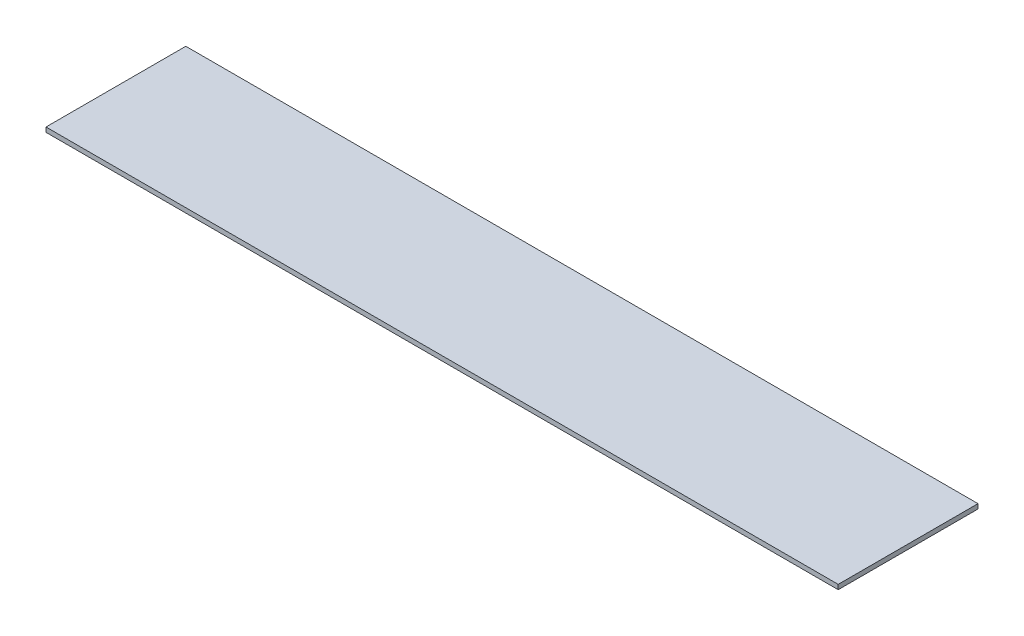
ISO-10303-21;
HEADER;
FILE_DESCRIPTION(('STEP AP214'),'2;1');
FILE_NAME('part.step','',(''),(''),'','','');
FILE_SCHEMA(('AUTOMOTIVE_DESIGN { 1 0 10303 214 1 1 1 1 }'));
ENDSEC;
DATA;
#1=APPLICATION_CONTEXT('core data for automotive mechanical design processes');
#2=APPLICATION_PROTOCOL_DEFINITION('international standard','automotive_design',2000,#1);
#3=PRODUCT_CONTEXT('',#1,'mechanical');
#4=PRODUCT('Part','Part','',(#3));
#5=PRODUCT_RELATED_PRODUCT_CATEGORY('part','',(#4));
#6=PRODUCT_DEFINITION_FORMATION('','',#4);
#7=PRODUCT_DEFINITION_CONTEXT('part definition',#1,'design');
#8=PRODUCT_DEFINITION('design','',#6,#7);
#9=PRODUCT_DEFINITION_SHAPE('','',#8);
#10=(LENGTH_UNIT() NAMED_UNIT(*) SI_UNIT(.MILLI.,.METRE.));
#11=(NAMED_UNIT(*) PLANE_ANGLE_UNIT() SI_UNIT($,.RADIAN.));
#12=(NAMED_UNIT(*) SI_UNIT($,.STERADIAN.) SOLID_ANGLE_UNIT());
#13=UNCERTAINTY_MEASURE_WITH_UNIT(LENGTH_MEASURE(1.E-05),#10,'distance_accuracy_value','');
#14=(GEOMETRIC_REPRESENTATION_CONTEXT(3) GLOBAL_UNCERTAINTY_ASSIGNED_CONTEXT((#13)) GLOBAL_UNIT_ASSIGNED_CONTEXT((#10,
#11,#12)) REPRESENTATION_CONTEXT('',''));
#15=CARTESIAN_POINT('',(0.,0.,0.));
#16=DIRECTION('',(0.,0.,1.));
#17=DIRECTION('',(1.,0.,0.));
#18=AXIS2_PLACEMENT_3D('',#15,#16,#17);
#19=CARTESIAN_POINT('',(-49.9300699300699,1.,-65.5827505827506));
#20=DIRECTION('',(1.,0.,0.));
#21=DIRECTION('',(0.,0.,-1.));
#22=AXIS2_PLACEMENT_3D('',#19,#20,#21);
#23=PLANE('',#22);
#24=DIRECTION('',(0.,0.,1.));
#25=VECTOR('',#24,1.);
#26=CARTESIAN_POINT('',(-49.9300699300699,0.,-65.5827505827506));
#27=LINE('',#26,#25);
#28=CARTESIAN_POINT('',(-49.9300699300699,0.,-65.5827505827506));
#29=VERTEX_POINT('',#28);
#30=CARTESIAN_POINT('',(-49.9300699300699,0.,-35.5827505827506));
#31=VERTEX_POINT('',#30);
#32=EDGE_CURVE('E96',#29,#31,#27,.T.);
#33=ORIENTED_EDGE('',*,*,#32,.T.);
#34=DIRECTION('',(0.,-1.,0.));
#35=VECTOR('',#34,1.);
#36=CARTESIAN_POINT('',(-49.9300699300699,1.,-35.5827505827506));
#37=LINE('',#36,#35);
#38=CARTESIAN_POINT('',(-49.9300699300699,1.,-35.5827505827506));
#39=VERTEX_POINT('',#38);
#40=EDGE_CURVE('E11',#39,#31,#37,.T.);
#41=ORIENTED_EDGE('',*,*,#40,.F.);
#42=DIRECTION('',(0.,0.,1.));
#43=VECTOR('',#42,1.);
#44=CARTESIAN_POINT('',(-49.9300699300699,1.,-65.5827505827506));
#45=LINE('',#44,#43);
#46=CARTESIAN_POINT('',(-49.9300699300699,1.,-65.5827505827506));
#47=VERTEX_POINT('',#46);
#48=EDGE_CURVE('E84',#47,#39,#45,.T.);
#49=ORIENTED_EDGE('',*,*,#48,.F.);
#50=DIRECTION('',(0.,-1.,0.));
#51=VECTOR('',#50,1.);
#52=CARTESIAN_POINT('',(-49.9300699300699,1.,-65.5827505827506));
#53=LINE('',#52,#51);
#54=EDGE_CURVE('E92',#47,#29,#53,.T.);
#55=ORIENTED_EDGE('',*,*,#54,.T.);
#56=EDGE_LOOP('',(#33,#41,#49,#55));
#57=FACE_BOUND('',#56,.T.);
#58=ADVANCED_FACE('F33',(#57),#23,.F.);
#59=CARTESIAN_POINT('',(-49.9300699300699,1.,-35.5827505827506));
#60=DIRECTION('',(0.,0.,-1.));
#61=DIRECTION('',(-1.,0.,0.));
#62=AXIS2_PLACEMENT_3D('',#59,#60,#61);
#63=PLANE('',#62);
#64=DIRECTION('',(1.,0.,0.));
#65=VECTOR('',#64,1.);
#66=CARTESIAN_POINT('',(-49.9300699300699,0.,-35.5827505827506));
#67=LINE('',#66,#65);
#68=CARTESIAN_POINT('',(120.06993006993,0.,-35.5827505827506));
#69=VERTEX_POINT('',#68);
#70=EDGE_CURVE('E88',#31,#69,#67,.T.);
#71=ORIENTED_EDGE('',*,*,#70,.T.);
#72=DIRECTION('',(0.,-1.,0.));
#73=VECTOR('',#72,1.);
#74=CARTESIAN_POINT('',(120.06993006993,1.,-35.5827505827506));
#75=LINE('',#74,#73);
#76=CARTESIAN_POINT('',(120.06993006993,1.,-35.5827505827506));
#77=VERTEX_POINT('',#76);
#78=EDGE_CURVE('E41',#77,#69,#75,.T.);
#79=ORIENTED_EDGE('',*,*,#78,.F.);
#80=DIRECTION('',(1.,0.,0.));
#81=VECTOR('',#80,1.);
#82=CARTESIAN_POINT('',(-49.9300699300699,1.,-35.5827505827506));
#83=LINE('',#82,#81);
#84=EDGE_CURVE('E79',#39,#77,#83,.T.);
#85=ORIENTED_EDGE('',*,*,#84,.F.);
#86=ORIENTED_EDGE('',*,*,#40,.T.);
#87=EDGE_LOOP('',(#71,#79,#85,#86));
#88=FACE_BOUND('',#87,.T.);
#89=ADVANCED_FACE('F87',(#88),#63,.F.);
#90=CARTESIAN_POINT('',(120.06993006993,1.,-65.5827505827506));
#91=DIRECTION('',(-1.,0.,0.));
#92=DIRECTION('',(0.,0.,1.));
#93=AXIS2_PLACEMENT_3D('',#90,#91,#92);
#94=PLANE('',#93);
#95=DIRECTION('',(0.,0.,-1.));
#96=VECTOR('',#95,1.);
#97=CARTESIAN_POINT('',(120.06993006993,0.,-65.5827505827506));
#98=LINE('',#97,#96);
#99=CARTESIAN_POINT('',(120.06993006993,0.,-65.5827505827506));
#100=VERTEX_POINT('',#99);
#101=EDGE_CURVE('E66',#69,#100,#98,.T.);
#102=ORIENTED_EDGE('',*,*,#101,.T.);
#103=DIRECTION('',(0.,-1.,0.));
#104=VECTOR('',#103,1.);
#105=CARTESIAN_POINT('',(120.06993006993,1.,-65.5827505827506));
#106=LINE('',#105,#104);
#107=CARTESIAN_POINT('',(120.06993006993,1.,-65.5827505827506));
#108=VERTEX_POINT('',#107);
#109=EDGE_CURVE('E89',#108,#100,#106,.T.);
#110=ORIENTED_EDGE('',*,*,#109,.F.);
#111=DIRECTION('',(0.,0.,-1.));
#112=VECTOR('',#111,1.);
#113=CARTESIAN_POINT('',(120.06993006993,1.,-65.5827505827506));
#114=LINE('',#113,#112);
#115=EDGE_CURVE('E82',#77,#108,#114,.T.);
#116=ORIENTED_EDGE('',*,*,#115,.F.);
#117=ORIENTED_EDGE('',*,*,#78,.T.);
#118=EDGE_LOOP('',(#102,#110,#116,#117));
#119=FACE_BOUND('',#118,.T.);
#120=ADVANCED_FACE('F90',(#119),#94,.F.);
#121=CARTESIAN_POINT('',(-49.9300699300699,1.,-65.5827505827506));
#122=DIRECTION('',(0.,0.,1.));
#123=DIRECTION('',(1.,0.,0.));
#124=AXIS2_PLACEMENT_3D('',#121,#122,#123);
#125=PLANE('',#124);
#126=DIRECTION('',(-1.,0.,0.));
#127=VECTOR('',#126,1.);
#128=CARTESIAN_POINT('',(-49.9300699300699,0.,-65.5827505827506));
#129=LINE('',#128,#127);
#130=EDGE_CURVE('E72',#100,#29,#129,.T.);
#131=ORIENTED_EDGE('',*,*,#130,.T.);
#132=ORIENTED_EDGE('',*,*,#54,.F.);
#133=DIRECTION('',(-1.,0.,0.));
#134=VECTOR('',#133,1.);
#135=CARTESIAN_POINT('',(-49.9300699300699,1.,-65.5827505827506));
#136=LINE('',#135,#134);
#137=EDGE_CURVE('E49',#108,#47,#136,.T.);
#138=ORIENTED_EDGE('',*,*,#137,.F.);
#139=ORIENTED_EDGE('',*,*,#109,.T.);
#140=EDGE_LOOP('',(#131,#132,#138,#139));
#141=FACE_BOUND('',#140,.T.);
#142=ADVANCED_FACE('F103',(#141),#125,.F.);
#143=CARTESIAN_POINT('',(0.,1.,0.));
#144=DIRECTION('',(0.,1.,0.));
#145=DIRECTION('',(0.,0.,1.));
#146=AXIS2_PLACEMENT_3D('',#143,#144,#145);
#147=PLANE('',#146);
#148=ORIENTED_EDGE('',*,*,#48,.T.);
#149=ORIENTED_EDGE('',*,*,#84,.T.);
#150=ORIENTED_EDGE('',*,*,#115,.T.);
#151=ORIENTED_EDGE('',*,*,#137,.T.);
#152=EDGE_LOOP('',(#148,#149,#150,#151));
#153=FACE_BOUND('',#152,.T.);
#154=ADVANCED_FACE('F80',(#153),#147,.T.);
#155=CARTESIAN_POINT('',(0.,0.,0.));
#156=DIRECTION('',(0.,1.,0.));
#157=DIRECTION('',(0.,0.,1.));
#158=AXIS2_PLACEMENT_3D('',#155,#156,#157);
#159=PLANE('',#158);
#160=ORIENTED_EDGE('',*,*,#32,.F.);
#161=ORIENTED_EDGE('',*,*,#130,.F.);
#162=ORIENTED_EDGE('',*,*,#101,.F.);
#163=ORIENTED_EDGE('',*,*,#70,.F.);
#164=EDGE_LOOP('',(#160,#161,#162,#163));
#165=FACE_BOUND('',#164,.T.);
#166=ADVANCED_FACE('F106',(#165),#159,.F.);
#167=CLOSED_SHELL('',(#58,#89,#120,#142,#154,#166));
#168=MANIFOLD_SOLID_BREP('B2',#167);
#169=ADVANCED_BREP_SHAPE_REPRESENTATION('',(#18,#168),#14);
#170=SHAPE_DEFINITION_REPRESENTATION(#9,#169);
ENDSEC;
END-ISO-10303-21;
